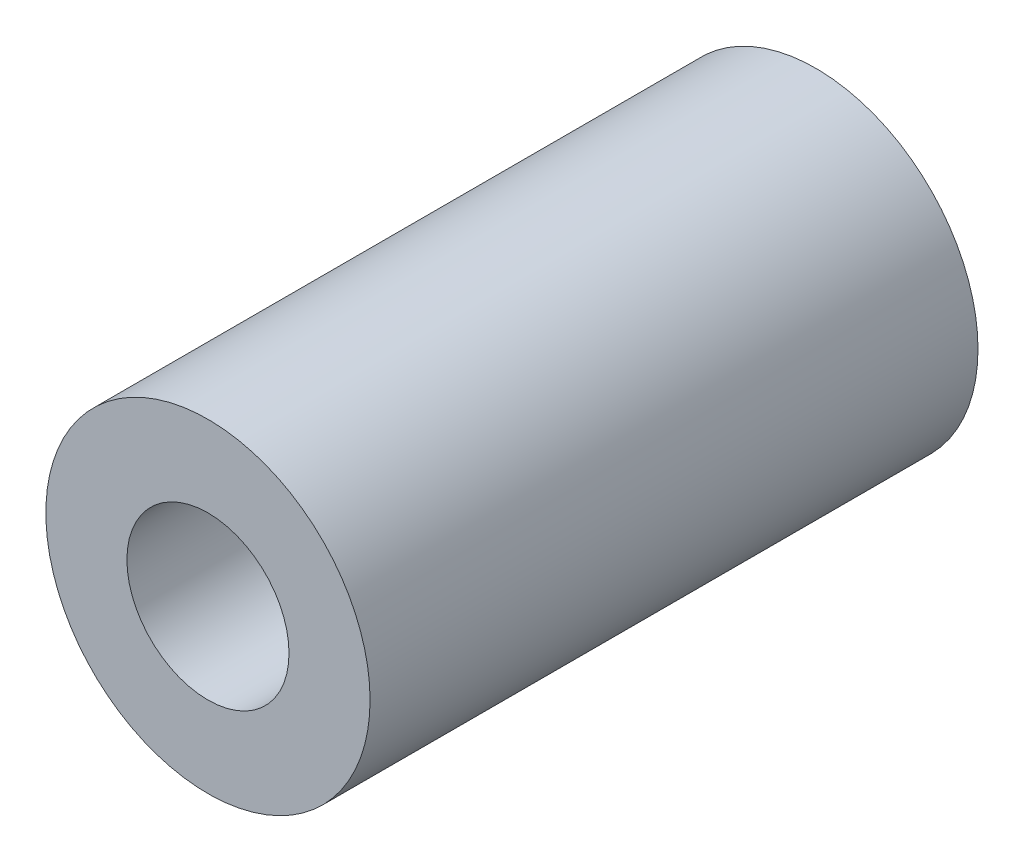
ISO-10303-21;
HEADER;
FILE_DESCRIPTION(('STEP AP214'),'2;1');
FILE_NAME('part.step','',(''),(''),'','','');
FILE_SCHEMA(('AUTOMOTIVE_DESIGN { 1 0 10303 214 1 1 1 1 }'));
ENDSEC;
DATA;
#1=APPLICATION_CONTEXT('core data for automotive mechanical design processes');
#2=APPLICATION_PROTOCOL_DEFINITION('international standard','automotive_design',2000,#1);
#3=PRODUCT_CONTEXT('',#1,'mechanical');
#4=PRODUCT('Part','Part','',(#3));
#5=PRODUCT_RELATED_PRODUCT_CATEGORY('part','',(#4));
#6=PRODUCT_DEFINITION_FORMATION('','',#4);
#7=PRODUCT_DEFINITION_CONTEXT('part definition',#1,'design');
#8=PRODUCT_DEFINITION('design','',#6,#7);
#9=PRODUCT_DEFINITION_SHAPE('','',#8);
#10=(LENGTH_UNIT() NAMED_UNIT(*) SI_UNIT(.MILLI.,.METRE.));
#11=(NAMED_UNIT(*) PLANE_ANGLE_UNIT() SI_UNIT($,.RADIAN.));
#12=(NAMED_UNIT(*) SI_UNIT($,.STERADIAN.) SOLID_ANGLE_UNIT());
#13=UNCERTAINTY_MEASURE_WITH_UNIT(LENGTH_MEASURE(1.E-05),#10,'distance_accuracy_value','');
#14=(GEOMETRIC_REPRESENTATION_CONTEXT(3) GLOBAL_UNCERTAINTY_ASSIGNED_CONTEXT((#13)) GLOBAL_UNIT_ASSIGNED_CONTEXT((#10,
#11,#12)) REPRESENTATION_CONTEXT('',''));
#15=CARTESIAN_POINT('',(0.,0.,0.));
#16=DIRECTION('',(0.,0.,1.));
#17=DIRECTION('',(1.,0.,0.));
#18=AXIS2_PLACEMENT_3D('',#15,#16,#17);
#19=CARTESIAN_POINT('',(0.,0.,0.));
#20=DIRECTION('',(0.,0.,1.));
#21=DIRECTION('',(1.,0.,0.));
#22=AXIS2_PLACEMENT_3D('',#19,#20,#21);
#23=PLANE('',#22);
#24=CARTESIAN_POINT('',(0.,0.,0.));
#25=DIRECTION('',(0.,0.,1.));
#26=DIRECTION('',(1.,0.,0.));
#27=AXIS2_PLACEMENT_3D('',#24,#25,#26);
#28=CIRCLE('',#27,2.5);
#29=CARTESIAN_POINT('',(2.5,0.,0.));
#30=VERTEX_POINT('',#29);
#31=EDGE_CURVE('E62',#30,#30,#28,.T.);
#32=ORIENTED_EDGE('',*,*,#31,.F.);
#33=EDGE_LOOP('',(#32));
#34=FACE_BOUND('',#33,.T.);
#35=CARTESIAN_POINT('',(0.,0.,0.));
#36=DIRECTION('',(0.,0.,1.));
#37=DIRECTION('',(1.,0.,0.));
#38=AXIS2_PLACEMENT_3D('',#35,#36,#37);
#39=CIRCLE('',#38,4.);
#40=CARTESIAN_POINT('',(4.,0.,0.));
#41=VERTEX_POINT('',#40);
#42=EDGE_CURVE('E72',#41,#41,#39,.T.);
#43=ORIENTED_EDGE('',*,*,#42,.T.);
#44=EDGE_LOOP('',(#43));
#45=FACE_BOUND('',#44,.T.);
#46=ADVANCED_FACE('F51',(#34,#45),#23,.T.);
#47=CARTESIAN_POINT('',(0.,0.,-15.));
#48=DIRECTION('',(0.,0.,1.));
#49=DIRECTION('',(1.,0.,0.));
#50=AXIS2_PLACEMENT_3D('',#47,#48,#49);
#51=CYLINDRICAL_SURFACE('',#50,8.);
#52=CARTESIAN_POINT('',(0.,0.,-15.));
#53=DIRECTION('',(0.,0.,1.));
#54=DIRECTION('',(1.,0.,0.));
#55=AXIS2_PLACEMENT_3D('',#52,#53,#54);
#56=CIRCLE('',#55,8.);
#57=CARTESIAN_POINT('',(8.,0.,-15.));
#58=VERTEX_POINT('',#57);
#59=EDGE_CURVE('E12',#58,#58,#56,.T.);
#60=ORIENTED_EDGE('',*,*,#59,.T.);
#61=EDGE_LOOP('',(#60));
#62=FACE_BOUND('',#61,.T.);
#63=CARTESIAN_POINT('',(0.,0.,15.));
#64=DIRECTION('',(0.,0.,1.));
#65=DIRECTION('',(1.,0.,0.));
#66=AXIS2_PLACEMENT_3D('',#63,#64,#65);
#67=CIRCLE('',#66,8.);
#68=CARTESIAN_POINT('',(8.,0.,15.));
#69=VERTEX_POINT('',#68);
#70=EDGE_CURVE('E67',#69,#69,#67,.T.);
#71=ORIENTED_EDGE('',*,*,#70,.F.);
#72=EDGE_LOOP('',(#71));
#73=FACE_BOUND('',#72,.T.);
#74=ADVANCED_FACE('F53',(#62,#73),#51,.T.);
#75=CARTESIAN_POINT('',(0.,0.,-15.));
#76=DIRECTION('',(0.,0.,1.));
#77=DIRECTION('',(1.,0.,0.));
#78=AXIS2_PLACEMENT_3D('',#75,#76,#77);
#79=PLANE('',#78);
#80=CARTESIAN_POINT('',(0.,0.,-15.));
#81=DIRECTION('',(0.,0.,1.));
#82=DIRECTION('',(1.,0.,0.));
#83=AXIS2_PLACEMENT_3D('',#80,#81,#82);
#84=CIRCLE('',#83,2.5);
#85=CARTESIAN_POINT('',(2.5,0.,-15.));
#86=VERTEX_POINT('',#85);
#87=EDGE_CURVE('E58',#86,#86,#84,.T.);
#88=ORIENTED_EDGE('',*,*,#87,.T.);
#89=EDGE_LOOP('',(#88));
#90=FACE_BOUND('',#89,.T.);
#91=ORIENTED_EDGE('',*,*,#59,.F.);
#92=EDGE_LOOP('',(#91));
#93=FACE_BOUND('',#92,.T.);
#94=ADVANCED_FACE('F91',(#90,#93),#79,.F.);
#95=CARTESIAN_POINT('',(0.,0.,-15.));
#96=DIRECTION('',(0.,0.,1.));
#97=DIRECTION('',(1.,0.,0.));
#98=AXIS2_PLACEMENT_3D('',#95,#96,#97);
#99=CYLINDRICAL_SURFACE('',#98,2.5);
#100=ORIENTED_EDGE('',*,*,#87,.F.);
#101=EDGE_LOOP('',(#100));
#102=FACE_BOUND('',#101,.T.);
#103=ORIENTED_EDGE('',*,*,#31,.T.);
#104=EDGE_LOOP('',(#103));
#105=FACE_BOUND('',#104,.T.);
#106=ADVANCED_FACE('F83',(#102,#105),#99,.F.);
#107=CARTESIAN_POINT('',(0.,0.,15.));
#108=DIRECTION('',(0.,0.,1.));
#109=DIRECTION('',(1.,0.,0.));
#110=AXIS2_PLACEMENT_3D('',#107,#108,#109);
#111=PLANE('',#110);
#112=ORIENTED_EDGE('',*,*,#70,.T.);
#113=EDGE_LOOP('',(#112));
#114=FACE_BOUND('',#113,.T.);
#115=CARTESIAN_POINT('',(0.,0.,15.));
#116=DIRECTION('',(0.,0.,1.));
#117=DIRECTION('',(1.,0.,0.));
#118=AXIS2_PLACEMENT_3D('',#115,#116,#117);
#119=CIRCLE('',#118,4.);
#120=CARTESIAN_POINT('',(4.,0.,15.));
#121=VERTEX_POINT('',#120);
#122=EDGE_CURVE('E71',#121,#121,#119,.T.);
#123=ORIENTED_EDGE('',*,*,#122,.F.);
#124=EDGE_LOOP('',(#123));
#125=FACE_BOUND('',#124,.T.);
#126=ADVANCED_FACE('F81',(#114,#125),#111,.T.);
#127=CARTESIAN_POINT('',(0.,0.,15.));
#128=DIRECTION('',(0.,0.,-1.));
#129=DIRECTION('',(-1.,0.,0.));
#130=AXIS2_PLACEMENT_3D('',#127,#128,#129);
#131=CYLINDRICAL_SURFACE('',#130,4.);
#132=ORIENTED_EDGE('',*,*,#122,.T.);
#133=EDGE_LOOP('',(#132));
#134=FACE_BOUND('',#133,.T.);
#135=ORIENTED_EDGE('',*,*,#42,.F.);
#136=EDGE_LOOP('',(#135));
#137=FACE_BOUND('',#136,.T.);
#138=ADVANCED_FACE('F78',(#134,#137),#131,.F.);
#139=CLOSED_SHELL('',(#46,#74,#94,#106,#126,#138));
#140=MANIFOLD_SOLID_BREP('B2',#139);
#141=ADVANCED_BREP_SHAPE_REPRESENTATION('',(#18,#140),#14);
#142=SHAPE_DEFINITION_REPRESENTATION(#9,#141);
ENDSEC;
END-ISO-10303-21;
